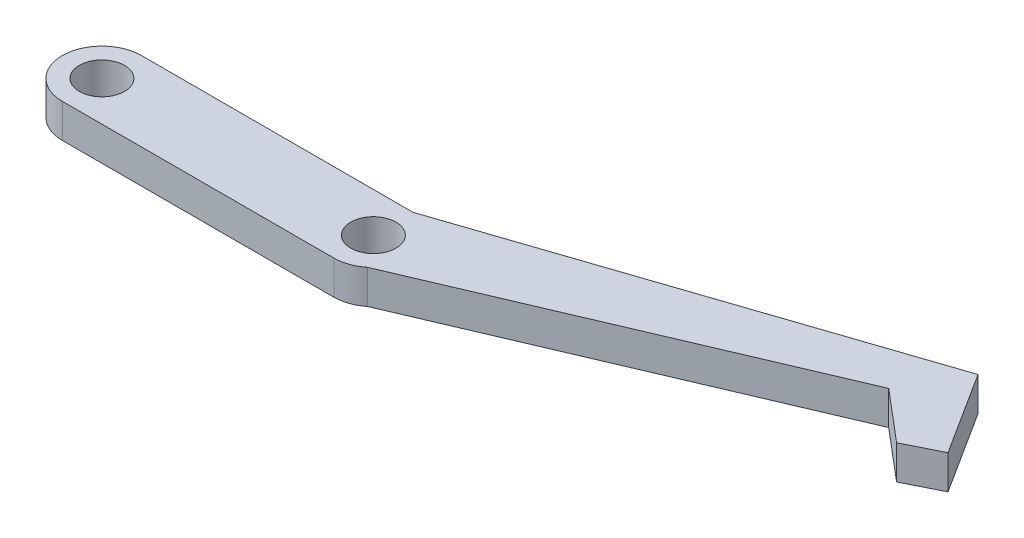
ISO-10303-21;
HEADER;
FILE_DESCRIPTION(('STEP AP214'),'2;1');
FILE_NAME('part.step','',(''),(''),'','','');
FILE_SCHEMA(('AUTOMOTIVE_DESIGN { 1 0 10303 214 1 1 1 1 }'));
ENDSEC;
DATA;
#1=APPLICATION_CONTEXT('core data for automotive mechanical design processes');
#2=APPLICATION_PROTOCOL_DEFINITION('international standard','automotive_design',2000,#1);
#3=PRODUCT_CONTEXT('',#1,'mechanical');
#4=PRODUCT('Part','Part','',(#3));
#5=PRODUCT_RELATED_PRODUCT_CATEGORY('part','',(#4));
#6=PRODUCT_DEFINITION_FORMATION('','',#4);
#7=PRODUCT_DEFINITION_CONTEXT('part definition',#1,'design');
#8=PRODUCT_DEFINITION('design','',#6,#7);
#9=PRODUCT_DEFINITION_SHAPE('','',#8);
#10=(LENGTH_UNIT() NAMED_UNIT(*) SI_UNIT(.MILLI.,.METRE.));
#11=(NAMED_UNIT(*) PLANE_ANGLE_UNIT() SI_UNIT($,.RADIAN.));
#12=(NAMED_UNIT(*) SI_UNIT($,.STERADIAN.) SOLID_ANGLE_UNIT());
#13=UNCERTAINTY_MEASURE_WITH_UNIT(LENGTH_MEASURE(1.E-05),#10,'distance_accuracy_value','');
#14=(GEOMETRIC_REPRESENTATION_CONTEXT(3) GLOBAL_UNCERTAINTY_ASSIGNED_CONTEXT((#13)) GLOBAL_UNIT_ASSIGNED_CONTEXT((#10,
#11,#12)) REPRESENTATION_CONTEXT('',''));
#15=CARTESIAN_POINT('',(0.,0.,0.));
#16=DIRECTION('',(0.,0.,1.));
#17=DIRECTION('',(1.,0.,0.));
#18=AXIS2_PLACEMENT_3D('',#15,#16,#17);
#19=CARTESIAN_POINT('',(0.,3.,18.7840243880021));
#20=DIRECTION('',(0.,0.,-1.));
#21=DIRECTION('',(-1.,0.,0.));
#22=AXIS2_PLACEMENT_3D('',#19,#20,#21);
#23=PLANE('',#22);
#24=DIRECTION('',(1.,0.,0.));
#25=VECTOR('',#24,1.);
#26=CARTESIAN_POINT('',(0.,0.,18.7840243880021));
#27=LINE('',#26,#25);
#28=CARTESIAN_POINT('',(-30.4182071638339,0.,18.7840243880021));
#29=VERTEX_POINT('',#28);
#30=CARTESIAN_POINT('',(-6.41820716383395,0.,18.7840243880021));
#31=VERTEX_POINT('',#30);
#32=EDGE_CURVE('E143',#29,#31,#27,.T.);
#33=ORIENTED_EDGE('',*,*,#32,.T.);
#34=DIRECTION('',(0.,-1.,0.));
#35=VECTOR('',#34,1.);
#36=CARTESIAN_POINT('',(-6.41820716383395,3.,18.7840243880021));
#37=LINE('',#36,#35);
#38=CARTESIAN_POINT('',(-6.41820716383395,3.,18.7840243880021));
#39=VERTEX_POINT('',#38);
#40=EDGE_CURVE('E11',#39,#31,#37,.T.);
#41=ORIENTED_EDGE('',*,*,#40,.F.);
#42=DIRECTION('',(1.,0.,0.));
#43=VECTOR('',#42,1.);
#44=CARTESIAN_POINT('',(0.,3.,18.7840243880021));
#45=LINE('',#44,#43);
#46=CARTESIAN_POINT('',(-30.4182071638339,3.,18.7840243880021));
#47=VERTEX_POINT('',#46);
#48=EDGE_CURVE('E170',#47,#39,#45,.T.);
#49=ORIENTED_EDGE('',*,*,#48,.F.);
#50=DIRECTION('',(0.,-1.,0.));
#51=VECTOR('',#50,1.);
#52=CARTESIAN_POINT('',(-30.4182071638339,3.,18.7840243880021));
#53=LINE('',#52,#51);
#54=EDGE_CURVE('E142',#47,#29,#53,.T.);
#55=ORIENTED_EDGE('',*,*,#54,.T.);
#56=EDGE_LOOP('',(#33,#41,#49,#55));
#57=FACE_BOUND('',#56,.T.);
#58=ADVANCED_FACE('F35',(#57),#23,.F.);
#59=CARTESIAN_POINT('',(-6.41820716383395,3.,15.2840243880021));
#60=DIRECTION('',(0.,-1.,0.));
#61=DIRECTION('',(0.,0.,-1.));
#62=AXIS2_PLACEMENT_3D('',#59,#60,#61);
#63=CYLINDRICAL_SURFACE('',#62,3.5);
#64=CARTESIAN_POINT('',(-6.41820716383395,0.,15.2840243880021));
#65=DIRECTION('',(0.,1.,0.));
#66=DIRECTION('',(0.,0.,1.));
#67=AXIS2_PLACEMENT_3D('',#64,#65,#66);
#68=CIRCLE('',#67,3.5);
#69=CARTESIAN_POINT('',(-4.22023226099525,0.,18.0077913248914));
#70=VERTEX_POINT('',#69);
#71=EDGE_CURVE('E146',#31,#70,#68,.T.);
#72=ORIENTED_EDGE('',*,*,#71,.T.);
#73=DIRECTION('',(0.,-1.,0.));
#74=VECTOR('',#73,1.);
#75=CARTESIAN_POINT('',(-4.22023226099525,3.,18.0077913248914));
#76=LINE('',#75,#74);
#77=CARTESIAN_POINT('',(-4.22023226099525,3.,18.0077913248914));
#78=VERTEX_POINT('',#77);
#79=EDGE_CURVE('E43',#78,#70,#76,.T.);
#80=ORIENTED_EDGE('',*,*,#79,.F.);
#81=CARTESIAN_POINT('',(-6.41820716383395,3.,15.2840243880021));
#82=DIRECTION('',(0.,1.,0.));
#83=DIRECTION('',(0.,0.,1.));
#84=AXIS2_PLACEMENT_3D('',#81,#82,#83);
#85=CIRCLE('',#84,3.5);
#86=EDGE_CURVE('E93',#39,#78,#85,.T.);
#87=ORIENTED_EDGE('',*,*,#86,.F.);
#88=ORIENTED_EDGE('',*,*,#40,.T.);
#89=EDGE_LOOP('',(#72,#80,#87,#88));
#90=FACE_BOUND('',#89,.T.);
#91=ADVANCED_FACE('F224',(#90),#63,.T.);
#92=CARTESIAN_POINT('',(5.84603974449955,3.,13.717950273621));
#93=DIRECTION('',(-0.392044216638799,0.,-0.919946374632821));
#94=DIRECTION('',(-0.919946374632821,0.,0.392044216638799));
#95=AXIS2_PLACEMENT_3D('',#92,#93,#94);
#96=PLANE('',#95);
#97=DIRECTION('',(0.919946374632821,0.,-0.392044216638799));
#98=VECTOR('',#97,1.);
#99=CARTESIAN_POINT('',(5.84603974449955,0.,13.717950273621));
#100=LINE('',#99,#98);
#101=CARTESIAN_POINT('',(28.0916803733724,0.,4.23775121587087));
#102=VERTEX_POINT('',#101);
#103=EDGE_CURVE('E148',#70,#102,#100,.T.);
#104=ORIENTED_EDGE('',*,*,#103,.T.);
#105=DIRECTION('',(0.,-1.,0.));
#106=VECTOR('',#105,1.);
#107=CARTESIAN_POINT('',(28.0916803733724,3.,4.23775121587087));
#108=LINE('',#107,#106);
#109=CARTESIAN_POINT('',(28.0916803733724,3.,4.23775121587087));
#110=VERTEX_POINT('',#109);
#111=EDGE_CURVE('E178',#110,#102,#108,.T.);
#112=ORIENTED_EDGE('',*,*,#111,.F.);
#113=DIRECTION('',(0.919946374632821,0.,-0.392044216638799));
#114=VECTOR('',#113,1.);
#115=CARTESIAN_POINT('',(5.84603974449955,3.,13.717950273621));
#116=LINE('',#115,#114);
#117=EDGE_CURVE('E185',#78,#110,#116,.T.);
#118=ORIENTED_EDGE('',*,*,#117,.F.);
#119=ORIENTED_EDGE('',*,*,#79,.T.);
#120=EDGE_LOOP('',(#104,#112,#118,#119));
#121=FACE_BOUND('',#120,.T.);
#122=ADVANCED_FACE('F183',(#121),#96,.F.);
#123=CARTESIAN_POINT('',(9.61573807723954,3.,-11.3774000150544));
#124=DIRECTION('',(-0.645500358907102,0.,0.763759966645806));
#125=DIRECTION('',(0.763759966645806,0.,0.645500358907102));
#126=AXIS2_PLACEMENT_3D('',#123,#124,#125);
#127=PLANE('',#126);
#128=DIRECTION('',(-0.763759966645806,0.,-0.645500358907102));
#129=VECTOR('',#128,1.);
#130=CARTESIAN_POINT('',(9.61573807723954,0.,-11.3774000150544));
#131=LINE('',#130,#129);
#132=CARTESIAN_POINT('',(32.6067227292295,0.,8.05369023920814));
#133=VERTEX_POINT('',#132);
#134=EDGE_CURVE('E151',#133,#102,#131,.T.);
#135=ORIENTED_EDGE('',*,*,#134,.F.);
#136=DIRECTION('',(0.,-1.,0.));
#137=VECTOR('',#136,1.);
#138=CARTESIAN_POINT('',(32.6067227292295,3.,8.05369023920814));
#139=LINE('',#138,#137);
#140=CARTESIAN_POINT('',(32.6067227292295,3.,8.05369023920814));
#141=VERTEX_POINT('',#140);
#142=EDGE_CURVE('E176',#141,#133,#139,.T.);
#143=ORIENTED_EDGE('',*,*,#142,.F.);
#144=DIRECTION('',(-0.763759966645806,0.,-0.645500358907102));
#145=VECTOR('',#144,1.);
#146=CARTESIAN_POINT('',(9.61573807723954,3.,-11.3774000150544));
#147=LINE('',#146,#145);
#148=EDGE_CURVE('E196',#141,#110,#147,.T.);
#149=ORIENTED_EDGE('',*,*,#148,.T.);
#150=ORIENTED_EDGE('',*,*,#111,.T.);
#151=EDGE_LOOP('',(#135,#143,#149,#150));
#152=FACE_BOUND('',#151,.T.);
#153=ADVANCED_FACE('F193',(#152),#127,.T.);
#154=CARTESIAN_POINT('',(9.74282064152916,3.,19.4856412830583));
#155=DIRECTION('',(0.447213595499958,0.,0.894427190999916));
#156=DIRECTION('',(0.894427190999916,0.,-0.447213595499958));
#157=AXIS2_PLACEMENT_3D('',#154,#155,#156);
#158=PLANE('',#157);
#159=DIRECTION('',(-0.894427190999916,0.,0.447213595499958));
#160=VECTOR('',#159,1.);
#161=CARTESIAN_POINT('',(9.74282064152916,0.,19.4856412830583));
#162=LINE('',#161,#160);
#163=CARTESIAN_POINT('',(35.636170503482,0.,6.53896635208189));
#164=VERTEX_POINT('',#163);
#165=EDGE_CURVE('E154',#164,#133,#162,.T.);
#166=ORIENTED_EDGE('',*,*,#165,.F.);
#167=DIRECTION('',(0.,-1.,0.));
#168=VECTOR('',#167,1.);
#169=CARTESIAN_POINT('',(35.636170503482,3.,6.53896635208189));
#170=LINE('',#169,#168);
#171=CARTESIAN_POINT('',(35.636170503482,3.,6.53896635208189));
#172=VERTEX_POINT('',#171);
#173=EDGE_CURVE('E174',#172,#164,#170,.T.);
#174=ORIENTED_EDGE('',*,*,#173,.F.);
#175=DIRECTION('',(-0.894427190999916,0.,0.447213595499958));
#176=VECTOR('',#175,1.);
#177=CARTESIAN_POINT('',(9.74282064152916,3.,19.4856412830583));
#178=LINE('',#177,#176);
#179=EDGE_CURVE('E198',#172,#141,#178,.T.);
#180=ORIENTED_EDGE('',*,*,#179,.T.);
#181=ORIENTED_EDGE('',*,*,#142,.T.);
#182=EDGE_LOOP('',(#166,#174,#180,#181));
#183=FACE_BOUND('',#182,.T.);
#184=ADVANCED_FACE('F235',(#183),#158,.T.);
#185=CARTESIAN_POINT('',(22.3757010551829,3.,-14.2633950949373));
#186=DIRECTION('',(0.84324623284517,0.,-0.537527479104491));
#187=DIRECTION('',(-0.537527479104491,0.,-0.84324623284517));
#188=AXIS2_PLACEMENT_3D('',#185,#186,#187);
#189=PLANE('',#188);
#190=DIRECTION('',(0.537527479104491,0.,0.84324623284517));
#191=VECTOR('',#190,1.);
#192=CARTESIAN_POINT('',(22.3757010551829,0.,-14.2633950949373));
#193=LINE('',#192,#191);
#194=CARTESIAN_POINT('',(30.9754816200166,0.,-0.772489333854404));
#195=VERTEX_POINT('',#194);
#196=EDGE_CURVE('E157',#195,#164,#193,.T.);
#197=ORIENTED_EDGE('',*,*,#196,.F.);
#198=DIRECTION('',(0.,-1.,0.));
#199=VECTOR('',#198,1.);
#200=CARTESIAN_POINT('',(30.9754816200166,3.,-0.772489333854404));
#201=LINE('',#200,#199);
#202=CARTESIAN_POINT('',(30.9754816200166,3.,-0.772489333854404));
#203=VERTEX_POINT('',#202);
#204=EDGE_CURVE('E121',#203,#195,#201,.T.);
#205=ORIENTED_EDGE('',*,*,#204,.F.);
#206=DIRECTION('',(0.537527479104491,0.,0.84324623284517));
#207=VECTOR('',#206,1.);
#208=CARTESIAN_POINT('',(22.3757010551829,3.,-14.2633950949373));
#209=LINE('',#208,#207);
#210=EDGE_CURVE('E129',#203,#172,#209,.T.);
#211=ORIENTED_EDGE('',*,*,#210,.T.);
#212=ORIENTED_EDGE('',*,*,#173,.T.);
#213=EDGE_LOOP('',(#197,#205,#211,#212));
#214=FACE_BOUND('',#213,.T.);
#215=ADVANCED_FACE('F205',(#214),#189,.T.);
#216=CARTESIAN_POINT('',(2.9056586141031,3.,8.65314181425678));
#217=DIRECTION('',(-0.318324964409089,0.,-0.947981654376261));
#218=DIRECTION('',(-0.947981654376261,0.,0.318324964409089));
#219=AXIS2_PLACEMENT_3D('',#216,#217,#218);
#220=PLANE('',#219);
#221=DIRECTION('',(0.947981654376261,0.,-0.318324964409089));
#222=VECTOR('',#221,1.);
#223=CARTESIAN_POINT('',(2.9056586141031,0.,8.65314181425678));
#224=LINE('',#223,#222);
#225=CARTESIAN_POINT('',(-6.41820716383395,0.,11.7840243880021));
#226=VERTEX_POINT('',#225);
#227=EDGE_CURVE('E116',#226,#195,#224,.T.);
#228=ORIENTED_EDGE('',*,*,#227,.F.);
#229=DIRECTION('',(0.,-1.,0.));
#230=VECTOR('',#229,1.);
#231=CARTESIAN_POINT('',(-6.41820716383395,3.,11.7840243880021));
#232=LINE('',#231,#230);
#233=CARTESIAN_POINT('',(-6.41820716383395,3.,11.7840243880021));
#234=VERTEX_POINT('',#233);
#235=EDGE_CURVE('E111',#234,#226,#232,.T.);
#236=ORIENTED_EDGE('',*,*,#235,.F.);
#237=DIRECTION('',(0.947981654376261,0.,-0.318324964409089));
#238=VECTOR('',#237,1.);
#239=CARTESIAN_POINT('',(2.9056586141031,3.,8.65314181425678));
#240=LINE('',#239,#238);
#241=EDGE_CURVE('E114',#234,#203,#240,.T.);
#242=ORIENTED_EDGE('',*,*,#241,.T.);
#243=ORIENTED_EDGE('',*,*,#204,.T.);
#244=EDGE_LOOP('',(#228,#236,#242,#243));
#245=FACE_BOUND('',#244,.T.);
#246=ADVANCED_FACE('F113',(#245),#220,.T.);
#247=CARTESIAN_POINT('',(0.,3.,11.7840243880021));
#248=DIRECTION('',(0.,0.,-1.));
#249=DIRECTION('',(-1.,0.,0.));
#250=AXIS2_PLACEMENT_3D('',#247,#248,#249);
#251=PLANE('',#250);
#252=DIRECTION('',(1.,0.,0.));
#253=VECTOR('',#252,1.);
#254=CARTESIAN_POINT('',(0.,0.,11.7840243880021));
#255=LINE('',#254,#253);
#256=CARTESIAN_POINT('',(-30.4182071638339,0.,11.7840243880021));
#257=VERTEX_POINT('',#256);
#258=EDGE_CURVE('E161',#257,#226,#255,.T.);
#259=ORIENTED_EDGE('',*,*,#258,.F.);
#260=DIRECTION('',(0.,-1.,0.));
#261=VECTOR('',#260,1.);
#262=CARTESIAN_POINT('',(-30.4182071638339,3.,11.7840243880021));
#263=LINE('',#262,#261);
#264=CARTESIAN_POINT('',(-30.4182071638339,3.,11.7840243880021));
#265=VERTEX_POINT('',#264);
#266=EDGE_CURVE('E82',#265,#257,#263,.T.);
#267=ORIENTED_EDGE('',*,*,#266,.F.);
#268=DIRECTION('',(1.,0.,0.));
#269=VECTOR('',#268,1.);
#270=CARTESIAN_POINT('',(0.,3.,11.7840243880021));
#271=LINE('',#270,#269);
#272=EDGE_CURVE('E126',#265,#234,#271,.T.);
#273=ORIENTED_EDGE('',*,*,#272,.T.);
#274=ORIENTED_EDGE('',*,*,#235,.T.);
#275=EDGE_LOOP('',(#259,#267,#273,#274));
#276=FACE_BOUND('',#275,.T.);
#277=ADVANCED_FACE('F131',(#276),#251,.T.);
#278=CARTESIAN_POINT('',(-30.4182071638339,3.,15.2840243880021));
#279=DIRECTION('',(0.,-1.,0.));
#280=DIRECTION('',(0.,0.,-1.));
#281=AXIS2_PLACEMENT_3D('',#278,#279,#280);
#282=CYLINDRICAL_SURFACE('',#281,2.);
#283=CARTESIAN_POINT('',(-30.4182071638339,3.,15.2840243880021));
#284=DIRECTION('',(0.,1.,0.));
#285=DIRECTION('',(0.,0.,1.));
#286=AXIS2_PLACEMENT_3D('',#283,#284,#285);
#287=CIRCLE('',#286,2.);
#288=CARTESIAN_POINT('',(-30.4182071638339,3.,17.2840243880021));
#289=VERTEX_POINT('',#288);
#290=EDGE_CURVE('E133',#289,#289,#287,.T.);
#291=ORIENTED_EDGE('',*,*,#290,.T.);
#292=EDGE_LOOP('',(#291));
#293=FACE_BOUND('',#292,.T.);
#294=CARTESIAN_POINT('',(-30.4182071638339,0.,15.2840243880021));
#295=DIRECTION('',(0.,1.,0.));
#296=DIRECTION('',(0.,0.,1.));
#297=AXIS2_PLACEMENT_3D('',#294,#295,#296);
#298=CIRCLE('',#297,2.);
#299=CARTESIAN_POINT('',(-30.4182071638339,0.,17.2840243880021));
#300=VERTEX_POINT('',#299);
#301=EDGE_CURVE('E164',#300,#300,#298,.T.);
#302=ORIENTED_EDGE('',*,*,#301,.F.);
#303=EDGE_LOOP('',(#302));
#304=FACE_BOUND('',#303,.T.);
#305=ADVANCED_FACE('F212',(#293,#304),#282,.F.);
#306=CARTESIAN_POINT('',(-30.4182071638339,3.,15.2840243880021));
#307=DIRECTION('',(0.,-1.,0.));
#308=DIRECTION('',(0.,0.,-1.));
#309=AXIS2_PLACEMENT_3D('',#306,#307,#308);
#310=CYLINDRICAL_SURFACE('',#309,3.5);
#311=CARTESIAN_POINT('',(-30.4182071638339,0.,15.2840243880021));
#312=DIRECTION('',(0.,1.,0.));
#313=DIRECTION('',(0.,0.,1.));
#314=AXIS2_PLACEMENT_3D('',#311,#312,#313);
#315=CIRCLE('',#314,3.5);
#316=EDGE_CURVE('E85',#257,#29,#315,.T.);
#317=ORIENTED_EDGE('',*,*,#316,.T.);
#318=ORIENTED_EDGE('',*,*,#54,.F.);
#319=CARTESIAN_POINT('',(-30.4182071638339,3.,15.2840243880021));
#320=DIRECTION('',(0.,1.,0.));
#321=DIRECTION('',(0.,0.,1.));
#322=AXIS2_PLACEMENT_3D('',#319,#320,#321);
#323=CIRCLE('',#322,3.5);
#324=EDGE_CURVE('E51',#265,#47,#323,.T.);
#325=ORIENTED_EDGE('',*,*,#324,.F.);
#326=ORIENTED_EDGE('',*,*,#266,.T.);
#327=EDGE_LOOP('',(#317,#318,#325,#326));
#328=FACE_BOUND('',#327,.T.);
#329=ADVANCED_FACE('F209',(#328),#310,.T.);
#330=CARTESIAN_POINT('',(-6.41820716383395,3.,15.2840243880021));
#331=DIRECTION('',(0.,-1.,0.));
#332=DIRECTION('',(0.,0.,-1.));
#333=AXIS2_PLACEMENT_3D('',#330,#331,#332);
#334=CYLINDRICAL_SURFACE('',#333,2.);
#335=CARTESIAN_POINT('',(-6.41820716383395,3.,15.2840243880021));
#336=DIRECTION('',(0.,1.,0.));
#337=DIRECTION('',(0.,0.,1.));
#338=AXIS2_PLACEMENT_3D('',#335,#336,#337);
#339=CIRCLE('',#338,2.);
#340=CARTESIAN_POINT('',(-6.41820716383395,3.,17.2840243880021));
#341=VERTEX_POINT('',#340);
#342=EDGE_CURVE('E139',#341,#341,#339,.T.);
#343=ORIENTED_EDGE('',*,*,#342,.T.);
#344=EDGE_LOOP('',(#343));
#345=FACE_BOUND('',#344,.T.);
#346=CARTESIAN_POINT('',(-6.41820716383395,0.,15.2840243880021));
#347=DIRECTION('',(0.,1.,0.));
#348=DIRECTION('',(0.,0.,1.));
#349=AXIS2_PLACEMENT_3D('',#346,#347,#348);
#350=CIRCLE('',#349,2.);
#351=CARTESIAN_POINT('',(-6.41820716383395,0.,17.2840243880021));
#352=VERTEX_POINT('',#351);
#353=EDGE_CURVE('E167',#352,#352,#350,.T.);
#354=ORIENTED_EDGE('',*,*,#353,.F.);
#355=EDGE_LOOP('',(#354));
#356=FACE_BOUND('',#355,.T.);
#357=ADVANCED_FACE('F211',(#345,#356),#334,.F.);
#358=CARTESIAN_POINT('',(0.,3.,0.));
#359=DIRECTION('',(0.,1.,0.));
#360=DIRECTION('',(0.,0.,1.));
#361=AXIS2_PLACEMENT_3D('',#358,#359,#360);
#362=PLANE('',#361);
#363=ORIENTED_EDGE('',*,*,#48,.T.);
#364=ORIENTED_EDGE('',*,*,#86,.T.);
#365=ORIENTED_EDGE('',*,*,#117,.T.);
#366=ORIENTED_EDGE('',*,*,#148,.F.);
#367=ORIENTED_EDGE('',*,*,#179,.F.);
#368=ORIENTED_EDGE('',*,*,#210,.F.);
#369=ORIENTED_EDGE('',*,*,#241,.F.);
#370=ORIENTED_EDGE('',*,*,#272,.F.);
#371=ORIENTED_EDGE('',*,*,#324,.T.);
#372=EDGE_LOOP('',(#363,#364,#365,#366,#367,#368,#369,#370,#371));
#373=FACE_BOUND('',#372,.T.);
#374=ORIENTED_EDGE('',*,*,#290,.F.);
#375=EDGE_LOOP('',(#374));
#376=FACE_BOUND('',#375,.T.);
#377=ORIENTED_EDGE('',*,*,#342,.F.);
#378=EDGE_LOOP('',(#377));
#379=FACE_BOUND('',#378,.T.);
#380=ADVANCED_FACE('F124',(#373,#376,#379),#362,.T.);
#381=CARTESIAN_POINT('',(0.,0.,0.));
#382=DIRECTION('',(0.,1.,0.));
#383=DIRECTION('',(0.,0.,1.));
#384=AXIS2_PLACEMENT_3D('',#381,#382,#383);
#385=PLANE('',#384);
#386=ORIENTED_EDGE('',*,*,#32,.F.);
#387=ORIENTED_EDGE('',*,*,#316,.F.);
#388=ORIENTED_EDGE('',*,*,#258,.T.);
#389=ORIENTED_EDGE('',*,*,#227,.T.);
#390=ORIENTED_EDGE('',*,*,#196,.T.);
#391=ORIENTED_EDGE('',*,*,#165,.T.);
#392=ORIENTED_EDGE('',*,*,#134,.T.);
#393=ORIENTED_EDGE('',*,*,#103,.F.);
#394=ORIENTED_EDGE('',*,*,#71,.F.);
#395=EDGE_LOOP('',(#386,#387,#388,#389,#390,#391,#392,#393,#394));
#396=FACE_BOUND('',#395,.T.);
#397=ORIENTED_EDGE('',*,*,#301,.T.);
#398=EDGE_LOOP('',(#397));
#399=FACE_BOUND('',#398,.T.);
#400=ORIENTED_EDGE('',*,*,#353,.T.);
#401=EDGE_LOOP('',(#400));
#402=FACE_BOUND('',#401,.T.);
#403=ADVANCED_FACE('F188',(#396,#399,#402),#385,.F.);
#404=CLOSED_SHELL('',(#58,#91,#122,#153,#184,#215,#246,#277,#305,#329,#357,#380,#403));
#405=MANIFOLD_SOLID_BREP('B2',#404);
#406=ADVANCED_BREP_SHAPE_REPRESENTATION('',(#18,#405),#14);
#407=SHAPE_DEFINITION_REPRESENTATION(#9,#406);
ENDSEC;
END-ISO-10303-21;
